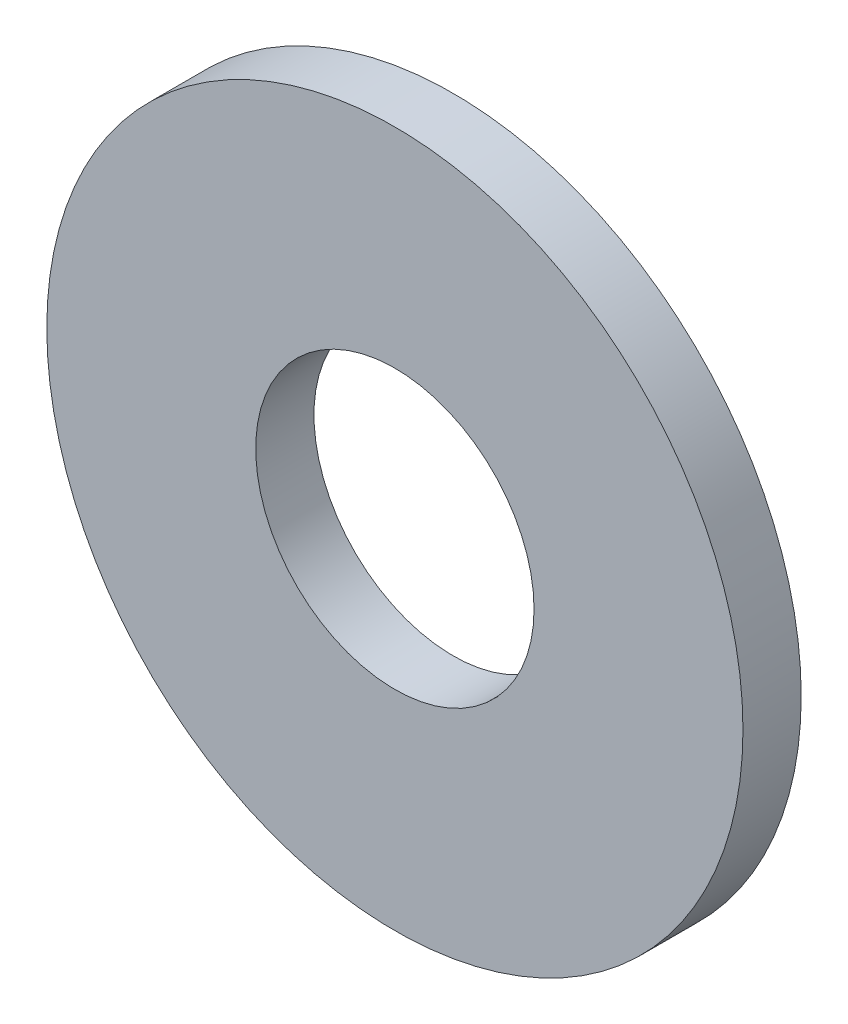
ISO-10303-21;
HEADER;
FILE_DESCRIPTION(('STEP AP214'),'2;1');
FILE_NAME('part.step','',(''),(''),'','','');
FILE_SCHEMA(('AUTOMOTIVE_DESIGN { 1 0 10303 214 1 1 1 1 }'));
ENDSEC;
DATA;
#1=APPLICATION_CONTEXT('core data for automotive mechanical design processes');
#2=APPLICATION_PROTOCOL_DEFINITION('international standard','automotive_design',2000,#1);
#3=PRODUCT_CONTEXT('',#1,'mechanical');
#4=PRODUCT('Part','Part','',(#3));
#5=PRODUCT_RELATED_PRODUCT_CATEGORY('part','',(#4));
#6=PRODUCT_DEFINITION_FORMATION('','',#4);
#7=PRODUCT_DEFINITION_CONTEXT('part definition',#1,'design');
#8=PRODUCT_DEFINITION('design','',#6,#7);
#9=PRODUCT_DEFINITION_SHAPE('','',#8);
#10=(LENGTH_UNIT() NAMED_UNIT(*) SI_UNIT(.MILLI.,.METRE.));
#11=(NAMED_UNIT(*) PLANE_ANGLE_UNIT() SI_UNIT($,.RADIAN.));
#12=(NAMED_UNIT(*) SI_UNIT($,.STERADIAN.) SOLID_ANGLE_UNIT());
#13=UNCERTAINTY_MEASURE_WITH_UNIT(LENGTH_MEASURE(1.E-05),#10,'distance_accuracy_value','');
#14=(GEOMETRIC_REPRESENTATION_CONTEXT(3) GLOBAL_UNCERTAINTY_ASSIGNED_CONTEXT((#13)) GLOBAL_UNIT_ASSIGNED_CONTEXT((#10,
#11,#12)) REPRESENTATION_CONTEXT('',''));
#15=CARTESIAN_POINT('',(0.,0.,0.));
#16=DIRECTION('',(0.,0.,1.));
#17=DIRECTION('',(1.,0.,0.));
#18=AXIS2_PLACEMENT_3D('',#15,#16,#17);
#19=CARTESIAN_POINT('',(0.,0.,6.35));
#20=DIRECTION('',(0.,0.,1.));
#21=DIRECTION('',(1.,0.,0.));
#22=AXIS2_PLACEMENT_3D('',#19,#20,#21);
#23=PLANE('',#22);
#24=CARTESIAN_POINT('',(0.,0.,6.35));
#25=DIRECTION('',(0.,0.,1.));
#26=DIRECTION('',(1.,0.,0.));
#27=AXIS2_PLACEMENT_3D('',#24,#25,#26);
#28=CIRCLE('',#27,37.9603);
#29=CARTESIAN_POINT('',(37.9603,0.,6.35));
#30=VERTEX_POINT('',#29);
#31=EDGE_CURVE('E10',#30,#30,#28,.T.);
#32=ORIENTED_EDGE('',*,*,#31,.T.);
#33=EDGE_LOOP('',(#32));
#34=FACE_BOUND('',#33,.T.);
#35=CARTESIAN_POINT('',(0.,0.,6.35));
#36=DIRECTION('',(0.,0.,1.));
#37=DIRECTION('',(1.,0.,0.));
#38=AXIS2_PLACEMENT_3D('',#35,#36,#37);
#39=CIRCLE('',#38,15.1765);
#40=CARTESIAN_POINT('',(15.1765,0.,6.35));
#41=VERTEX_POINT('',#40);
#42=EDGE_CURVE('E45',#41,#41,#39,.T.);
#43=ORIENTED_EDGE('',*,*,#42,.F.);
#44=EDGE_LOOP('',(#43));
#45=FACE_BOUND('',#44,.T.);
#46=ADVANCED_FACE('F34',(#34,#45),#23,.T.);
#47=CARTESIAN_POINT('',(0.,0.,0.));
#48=DIRECTION('',(0.,0.,1.));
#49=DIRECTION('',(1.,0.,0.));
#50=AXIS2_PLACEMENT_3D('',#47,#48,#49);
#51=PLANE('',#50);
#52=CARTESIAN_POINT('',(0.,0.,0.));
#53=DIRECTION('',(0.,0.,1.));
#54=DIRECTION('',(1.,0.,0.));
#55=AXIS2_PLACEMENT_3D('',#52,#53,#54);
#56=CIRCLE('',#55,37.9603);
#57=CARTESIAN_POINT('',(37.9603,0.,0.));
#58=VERTEX_POINT('',#57);
#59=EDGE_CURVE('E38',#58,#58,#56,.T.);
#60=ORIENTED_EDGE('',*,*,#59,.F.);
#61=EDGE_LOOP('',(#60));
#62=FACE_BOUND('',#61,.T.);
#63=CARTESIAN_POINT('',(0.,0.,0.));
#64=DIRECTION('',(0.,0.,1.));
#65=DIRECTION('',(1.,0.,0.));
#66=AXIS2_PLACEMENT_3D('',#63,#64,#65);
#67=CIRCLE('',#66,15.1765);
#68=CARTESIAN_POINT('',(15.1765,0.,0.));
#69=VERTEX_POINT('',#68);
#70=EDGE_CURVE('E47',#69,#69,#67,.T.);
#71=ORIENTED_EDGE('',*,*,#70,.T.);
#72=EDGE_LOOP('',(#71));
#73=FACE_BOUND('',#72,.T.);
#74=ADVANCED_FACE('F57',(#62,#73),#51,.F.);
#75=CARTESIAN_POINT('',(0.,0.,6.35));
#76=DIRECTION('',(0.,0.,-1.));
#77=DIRECTION('',(-1.,0.,0.));
#78=AXIS2_PLACEMENT_3D('',#75,#76,#77);
#79=CYLINDRICAL_SURFACE('',#78,37.9603);
#80=ORIENTED_EDGE('',*,*,#31,.F.);
#81=EDGE_LOOP('',(#80));
#82=FACE_BOUND('',#81,.T.);
#83=ORIENTED_EDGE('',*,*,#59,.T.);
#84=EDGE_LOOP('',(#83));
#85=FACE_BOUND('',#84,.T.);
#86=ADVANCED_FACE('F36',(#82,#85),#79,.T.);
#87=CARTESIAN_POINT('',(0.,0.,6.35));
#88=DIRECTION('',(0.,0.,-1.));
#89=DIRECTION('',(-1.,0.,0.));
#90=AXIS2_PLACEMENT_3D('',#87,#88,#89);
#91=CYLINDRICAL_SURFACE('',#90,15.1765);
#92=ORIENTED_EDGE('',*,*,#42,.T.);
#93=EDGE_LOOP('',(#92));
#94=FACE_BOUND('',#93,.T.);
#95=ORIENTED_EDGE('',*,*,#70,.F.);
#96=EDGE_LOOP('',(#95));
#97=FACE_BOUND('',#96,.T.);
#98=ADVANCED_FACE('F53',(#94,#97),#91,.F.);
#99=CLOSED_SHELL('',(#46,#74,#86,#98));
#100=MANIFOLD_SOLID_BREP('B2',#99);
#101=ADVANCED_BREP_SHAPE_REPRESENTATION('',(#18,#100),#14);
#102=SHAPE_DEFINITION_REPRESENTATION(#9,#101);
ENDSEC;
END-ISO-10303-21;
